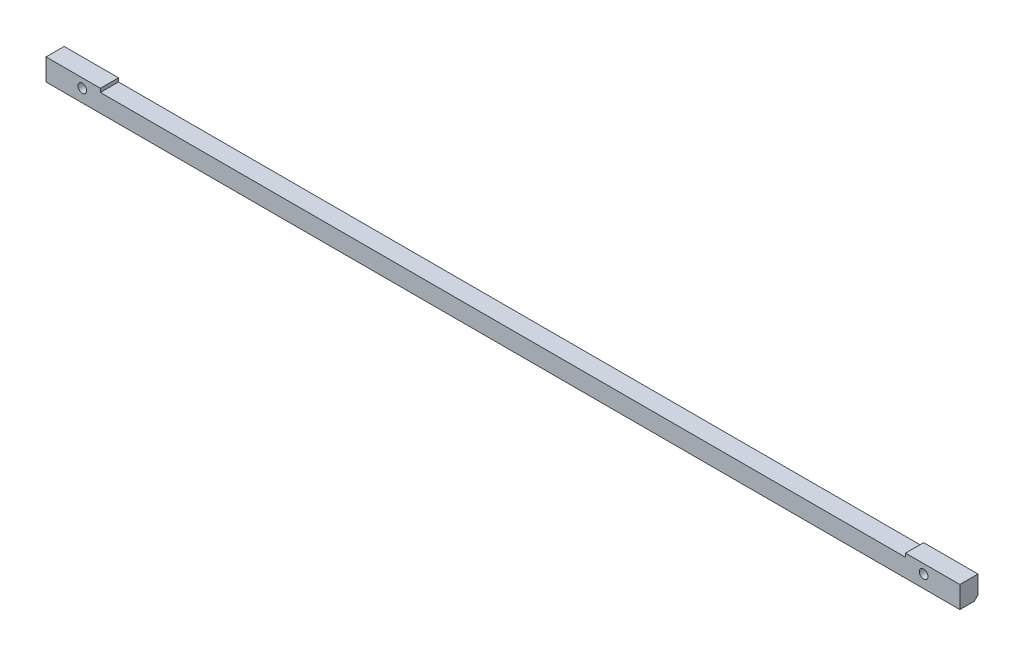
ISO-10303-21;
HEADER;
FILE_DESCRIPTION(('STEP AP214'),'2;1');
FILE_NAME('part.step','',(''),(''),'','','');
FILE_SCHEMA(('AUTOMOTIVE_DESIGN { 1 0 10303 214 1 1 1 1 }'));
ENDSEC;
DATA;
#1=APPLICATION_CONTEXT('core data for automotive mechanical design processes');
#2=APPLICATION_PROTOCOL_DEFINITION('international standard','automotive_design',2000,#1);
#3=PRODUCT_CONTEXT('',#1,'mechanical');
#4=PRODUCT('Part','Part','',(#3));
#5=PRODUCT_RELATED_PRODUCT_CATEGORY('part','',(#4));
#6=PRODUCT_DEFINITION_FORMATION('','',#4);
#7=PRODUCT_DEFINITION_CONTEXT('part definition',#1,'design');
#8=PRODUCT_DEFINITION('design','',#6,#7);
#9=PRODUCT_DEFINITION_SHAPE('','',#8);
#10=(LENGTH_UNIT() NAMED_UNIT(*) SI_UNIT(.MILLI.,.METRE.));
#11=(NAMED_UNIT(*) PLANE_ANGLE_UNIT() SI_UNIT($,.RADIAN.));
#12=(NAMED_UNIT(*) SI_UNIT($,.STERADIAN.) SOLID_ANGLE_UNIT());
#13=UNCERTAINTY_MEASURE_WITH_UNIT(LENGTH_MEASURE(1.E-05),#10,'distance_accuracy_value','');
#14=(GEOMETRIC_REPRESENTATION_CONTEXT(3) GLOBAL_UNCERTAINTY_ASSIGNED_CONTEXT((#13)) GLOBAL_UNIT_ASSIGNED_CONTEXT((#10,
#11,#12)) REPRESENTATION_CONTEXT('',''));
#15=CARTESIAN_POINT('',(0.,0.,0.));
#16=DIRECTION('',(0.,0.,1.));
#17=DIRECTION('',(1.,0.,0.));
#18=AXIS2_PLACEMENT_3D('',#15,#16,#17);
#19=CARTESIAN_POINT('',(126.,0.,5.));
#20=DIRECTION('',(-1.,0.,0.));
#21=DIRECTION('',(0.,0.,1.));
#22=AXIS2_PLACEMENT_3D('',#19,#20,#21);
#23=PLANE('',#22);
#24=DIRECTION('',(0.,0.,-1.));
#25=VECTOR('',#24,1.);
#26=CARTESIAN_POINT('',(126.,0.,5.));
#27=LINE('',#26,#25);
#28=CARTESIAN_POINT('',(126.,0.,5.));
#29=VERTEX_POINT('',#28);
#30=CARTESIAN_POINT('',(126.,0.,1.));
#31=VERTEX_POINT('',#30);
#32=EDGE_CURVE('E147',#29,#31,#27,.T.);
#33=ORIENTED_EDGE('',*,*,#32,.T.);
#34=DIRECTION('',(0.,-0.707106781186547,0.707106781186548));
#35=VECTOR('',#34,1.);
#36=CARTESIAN_POINT('',(126.,0.,1.00000000000002));
#37=LINE('',#36,#35);
#38=CARTESIAN_POINT('',(126.,1.00000000000005,0.));
#39=VERTEX_POINT('',#38);
#40=EDGE_CURVE('E56',#31,#39,#37,.F.);
#41=ORIENTED_EDGE('',*,*,#40,.T.);
#42=DIRECTION('',(0.,1.,0.));
#43=VECTOR('',#42,1.);
#44=CARTESIAN_POINT('',(126.,0.,0.));
#45=LINE('',#44,#43);
#46=CARTESIAN_POINT('',(126.,6.00000000000005,0.));
#47=VERTEX_POINT('',#46);
#48=EDGE_CURVE('E123',#39,#47,#45,.T.);
#49=ORIENTED_EDGE('',*,*,#48,.T.);
#50=DIRECTION('',(0.,0.,-1.));
#51=VECTOR('',#50,1.);
#52=CARTESIAN_POINT('',(126.,6.00000000000005,5.));
#53=LINE('',#52,#51);
#54=CARTESIAN_POINT('',(126.,6.00000000000005,5.));
#55=VERTEX_POINT('',#54);
#56=EDGE_CURVE('E108',#55,#47,#53,.T.);
#57=ORIENTED_EDGE('',*,*,#56,.F.);
#58=DIRECTION('',(0.,1.,0.));
#59=VECTOR('',#58,1.);
#60=CARTESIAN_POINT('',(126.,0.,5.));
#61=LINE('',#60,#59);
#62=EDGE_CURVE('E114',#29,#55,#61,.T.);
#63=ORIENTED_EDGE('',*,*,#62,.F.);
#64=EDGE_LOOP('',(#33,#41,#49,#57,#63));
#65=FACE_BOUND('',#64,.T.);
#66=ADVANCED_FACE('F34',(#65),#23,.F.);
#67=CARTESIAN_POINT('',(126.,6.00000000000005,5.));
#68=DIRECTION('',(0.,-1.,0.));
#69=DIRECTION('',(1.,0.,0.));
#70=AXIS2_PLACEMENT_3D('',#67,#68,#69);
#71=PLANE('',#70);
#72=DIRECTION('',(-1.,0.,0.));
#73=VECTOR('',#72,1.);
#74=CARTESIAN_POINT('',(126.,6.00000000000005,0.));
#75=LINE('',#74,#73);
#76=CARTESIAN_POINT('',(111.,6.00000000000004,0.));
#77=VERTEX_POINT('',#76);
#78=EDGE_CURVE('E158',#47,#77,#75,.T.);
#79=ORIENTED_EDGE('',*,*,#78,.T.);
#80=DIRECTION('',(0.,0.,-1.));
#81=VECTOR('',#80,1.);
#82=CARTESIAN_POINT('',(111.,6.00000000000004,5.));
#83=LINE('',#82,#81);
#84=CARTESIAN_POINT('',(111.,6.00000000000004,5.));
#85=VERTEX_POINT('',#84);
#86=EDGE_CURVE('E110',#85,#77,#83,.T.);
#87=ORIENTED_EDGE('',*,*,#86,.F.);
#88=DIRECTION('',(-1.,0.,0.));
#89=VECTOR('',#88,1.);
#90=CARTESIAN_POINT('',(126.,6.00000000000005,5.));
#91=LINE('',#90,#89);
#92=EDGE_CURVE('E104',#55,#85,#91,.T.);
#93=ORIENTED_EDGE('',*,*,#92,.F.);
#94=ORIENTED_EDGE('',*,*,#56,.T.);
#95=EDGE_LOOP('',(#79,#87,#93,#94));
#96=FACE_BOUND('',#95,.T.);
#97=ADVANCED_FACE('F106',(#96),#71,.F.);
#98=CARTESIAN_POINT('',(111.,6.00000000000004,5.));
#99=DIRECTION('',(1.,0.,0.));
#100=DIRECTION('',(0.,0.,-1.));
#101=AXIS2_PLACEMENT_3D('',#98,#99,#100);
#102=PLANE('',#101);
#103=DIRECTION('',(0.,-1.,0.));
#104=VECTOR('',#103,1.);
#105=CARTESIAN_POINT('',(111.,6.00000000000004,0.));
#106=LINE('',#105,#104);
#107=CARTESIAN_POINT('',(111.,4.99999999999996,0.));
#108=VERTEX_POINT('',#107);
#109=EDGE_CURVE('E156',#77,#108,#106,.T.);
#110=ORIENTED_EDGE('',*,*,#109,.T.);
#111=DIRECTION('',(0.,0.,-1.));
#112=VECTOR('',#111,1.);
#113=CARTESIAN_POINT('',(111.,4.99999999999996,5.));
#114=LINE('',#113,#112);
#115=CARTESIAN_POINT('',(111.,4.99999999999996,5.));
#116=VERTEX_POINT('',#115);
#117=EDGE_CURVE('E129',#116,#108,#114,.T.);
#118=ORIENTED_EDGE('',*,*,#117,.F.);
#119=DIRECTION('',(0.,-1.,0.));
#120=VECTOR('',#119,1.);
#121=CARTESIAN_POINT('',(111.,6.00000000000004,5.));
#122=LINE('',#121,#120);
#123=EDGE_CURVE('E113',#85,#116,#122,.T.);
#124=ORIENTED_EDGE('',*,*,#123,.F.);
#125=ORIENTED_EDGE('',*,*,#86,.T.);
#126=EDGE_LOOP('',(#110,#118,#124,#125));
#127=FACE_BOUND('',#126,.T.);
#128=ADVANCED_FACE('F227',(#127),#102,.F.);
#129=CARTESIAN_POINT('',(111.,4.99999999999996,5.));
#130=DIRECTION('',(0.,-1.,0.));
#131=DIRECTION('',(0.,0.,-1.));
#132=AXIS2_PLACEMENT_3D('',#129,#130,#131);
#133=PLANE('',#132);
#134=DIRECTION('',(-1.,0.,0.));
#135=VECTOR('',#134,1.);
#136=CARTESIAN_POINT('',(111.,4.99999999999996,0.));
#137=LINE('',#136,#135);
#138=CARTESIAN_POINT('',(-111.,4.99999999999996,0.));
#139=VERTEX_POINT('',#138);
#140=EDGE_CURVE('E154',#108,#139,#137,.T.);
#141=ORIENTED_EDGE('',*,*,#140,.T.);
#142=DIRECTION('',(0.,0.,-1.));
#143=VECTOR('',#142,1.);
#144=CARTESIAN_POINT('',(-111.,4.99999999999996,5.));
#145=LINE('',#144,#143);
#146=CARTESIAN_POINT('',(-111.,4.99999999999996,5.));
#147=VERTEX_POINT('',#146);
#148=EDGE_CURVE('E135',#147,#139,#145,.T.);
#149=ORIENTED_EDGE('',*,*,#148,.F.);
#150=DIRECTION('',(-1.,0.,0.));
#151=VECTOR('',#150,1.);
#152=CARTESIAN_POINT('',(111.,4.99999999999996,5.));
#153=LINE('',#152,#151);
#154=EDGE_CURVE('E169',#116,#147,#153,.T.);
#155=ORIENTED_EDGE('',*,*,#154,.F.);
#156=ORIENTED_EDGE('',*,*,#117,.T.);
#157=EDGE_LOOP('',(#141,#149,#155,#156));
#158=FACE_BOUND('',#157,.T.);
#159=ADVANCED_FACE('F232',(#158),#133,.F.);
#160=CARTESIAN_POINT('',(-111.,6.00000000000004,5.));
#161=DIRECTION('',(-1.,0.,0.));
#162=DIRECTION('',(0.,0.,1.));
#163=AXIS2_PLACEMENT_3D('',#160,#161,#162);
#164=PLANE('',#163);
#165=DIRECTION('',(0.,1.,0.));
#166=VECTOR('',#165,1.);
#167=CARTESIAN_POINT('',(-111.,6.00000000000004,0.));
#168=LINE('',#167,#166);
#169=CARTESIAN_POINT('',(-111.,6.00000000000004,0.));
#170=VERTEX_POINT('',#169);
#171=EDGE_CURVE('E152',#139,#170,#168,.T.);
#172=ORIENTED_EDGE('',*,*,#171,.T.);
#173=DIRECTION('',(0.,0.,-1.));
#174=VECTOR('',#173,1.);
#175=CARTESIAN_POINT('',(-111.,6.00000000000004,5.));
#176=LINE('',#175,#174);
#177=CARTESIAN_POINT('',(-111.,6.00000000000004,5.));
#178=VERTEX_POINT('',#177);
#179=EDGE_CURVE('E138',#178,#170,#176,.T.);
#180=ORIENTED_EDGE('',*,*,#179,.F.);
#181=DIRECTION('',(0.,1.,0.));
#182=VECTOR('',#181,1.);
#183=CARTESIAN_POINT('',(-111.,6.00000000000004,5.));
#184=LINE('',#183,#182);
#185=EDGE_CURVE('E167',#147,#178,#184,.T.);
#186=ORIENTED_EDGE('',*,*,#185,.F.);
#187=ORIENTED_EDGE('',*,*,#148,.T.);
#188=EDGE_LOOP('',(#172,#180,#186,#187));
#189=FACE_BOUND('',#188,.T.);
#190=ADVANCED_FACE('F236',(#189),#164,.F.);
#191=CARTESIAN_POINT('',(-126.,6.00000000000005,5.));
#192=DIRECTION('',(0.,-1.,0.));
#193=DIRECTION('',(1.,0.,0.));
#194=AXIS2_PLACEMENT_3D('',#191,#192,#193);
#195=PLANE('',#194);
#196=DIRECTION('',(-1.,0.,0.));
#197=VECTOR('',#196,1.);
#198=CARTESIAN_POINT('',(-126.,6.00000000000005,0.));
#199=LINE('',#198,#197);
#200=CARTESIAN_POINT('',(-126.,6.00000000000005,0.));
#201=VERTEX_POINT('',#200);
#202=EDGE_CURVE('E150',#170,#201,#199,.T.);
#203=ORIENTED_EDGE('',*,*,#202,.T.);
#204=DIRECTION('',(0.,0.,-1.));
#205=VECTOR('',#204,1.);
#206=CARTESIAN_POINT('',(-126.,6.00000000000005,5.));
#207=LINE('',#206,#205);
#208=CARTESIAN_POINT('',(-126.,6.00000000000005,5.));
#209=VERTEX_POINT('',#208);
#210=EDGE_CURVE('E141',#209,#201,#207,.T.);
#211=ORIENTED_EDGE('',*,*,#210,.F.);
#212=DIRECTION('',(-1.,0.,0.));
#213=VECTOR('',#212,1.);
#214=CARTESIAN_POINT('',(-126.,6.00000000000005,5.));
#215=LINE('',#214,#213);
#216=EDGE_CURVE('E165',#178,#209,#215,.T.);
#217=ORIENTED_EDGE('',*,*,#216,.F.);
#218=ORIENTED_EDGE('',*,*,#179,.T.);
#219=EDGE_LOOP('',(#203,#211,#217,#218));
#220=FACE_BOUND('',#219,.T.);
#221=ADVANCED_FACE('F221',(#220),#195,.F.);
#222=CARTESIAN_POINT('',(-126.,0.,5.));
#223=DIRECTION('',(1.,0.,0.));
#224=DIRECTION('',(0.,0.,-1.));
#225=AXIS2_PLACEMENT_3D('',#222,#223,#224);
#226=PLANE('',#225);
#227=DIRECTION('',(0.,-1.,0.));
#228=VECTOR('',#227,1.);
#229=CARTESIAN_POINT('',(-126.,0.,0.));
#230=LINE('',#229,#228);
#231=CARTESIAN_POINT('',(-126.,1.,0.));
#232=VERTEX_POINT('',#231);
#233=EDGE_CURVE('E121',#201,#232,#230,.T.);
#234=ORIENTED_EDGE('',*,*,#233,.T.);
#235=DIRECTION('',(0.,0.707106781186547,-0.707106781186548));
#236=VECTOR('',#235,1.);
#237=CARTESIAN_POINT('',(-126.,0.,1.));
#238=LINE('',#237,#236);
#239=CARTESIAN_POINT('',(-126.,0.,1.));
#240=VERTEX_POINT('',#239);
#241=EDGE_CURVE('E11',#232,#240,#238,.F.);
#242=ORIENTED_EDGE('',*,*,#241,.T.);
#243=DIRECTION('',(0.,0.,-1.));
#244=VECTOR('',#243,1.);
#245=CARTESIAN_POINT('',(-126.,0.,5.));
#246=LINE('',#245,#244);
#247=CARTESIAN_POINT('',(-126.,0.,5.));
#248=VERTEX_POINT('',#247);
#249=EDGE_CURVE('E144',#248,#240,#246,.T.);
#250=ORIENTED_EDGE('',*,*,#249,.F.);
#251=DIRECTION('',(0.,-1.,0.));
#252=VECTOR('',#251,1.);
#253=CARTESIAN_POINT('',(-126.,0.,5.));
#254=LINE('',#253,#252);
#255=EDGE_CURVE('E163',#209,#248,#254,.T.);
#256=ORIENTED_EDGE('',*,*,#255,.F.);
#257=ORIENTED_EDGE('',*,*,#210,.T.);
#258=EDGE_LOOP('',(#234,#242,#250,#256,#257));
#259=FACE_BOUND('',#258,.T.);
#260=ADVANCED_FACE('F209',(#259),#226,.F.);
#261=CARTESIAN_POINT('',(-126.,0.,5.));
#262=DIRECTION('',(0.,1.,0.));
#263=DIRECTION('',(-1.,0.,0.));
#264=AXIS2_PLACEMENT_3D('',#261,#262,#263);
#265=PLANE('',#264);
#266=ORIENTED_EDGE('',*,*,#249,.T.);
#267=DIRECTION('',(1.,0.,0.));
#268=VECTOR('',#267,1.);
#269=CARTESIAN_POINT('',(-126.,0.,1.));
#270=LINE('',#269,#268);
#271=EDGE_CURVE('E125',#240,#31,#270,.T.);
#272=ORIENTED_EDGE('',*,*,#271,.T.);
#273=ORIENTED_EDGE('',*,*,#32,.F.);
#274=DIRECTION('',(1.,0.,0.));
#275=VECTOR('',#274,1.);
#276=CARTESIAN_POINT('',(-126.,0.,5.));
#277=LINE('',#276,#275);
#278=EDGE_CURVE('E119',#248,#29,#277,.T.);
#279=ORIENTED_EDGE('',*,*,#278,.F.);
#280=EDGE_LOOP('',(#266,#272,#273,#279));
#281=FACE_BOUND('',#280,.T.);
#282=ADVANCED_FACE('F212',(#281),#265,.F.);
#283=CARTESIAN_POINT('',(126.,6.00000000000005,5.));
#284=DIRECTION('',(0.,0.,1.));
#285=DIRECTION('',(1.,0.,0.));
#286=AXIS2_PLACEMENT_3D('',#283,#284,#285);
#287=PLANE('',#286);
#288=CARTESIAN_POINT('',(116.,3.50000000000005,5.));
#289=DIRECTION('',(0.,0.,-1.));
#290=DIRECTION('',(-1.,0.,0.));
#291=AXIS2_PLACEMENT_3D('',#288,#289,#290);
#292=CIRCLE('',#291,1.19999999999999);
#293=CARTESIAN_POINT('',(114.8,3.50000000000005,5.));
#294=VERTEX_POINT('',#293);
#295=EDGE_CURVE('E183',#294,#294,#292,.T.);
#296=ORIENTED_EDGE('',*,*,#295,.T.);
#297=EDGE_LOOP('',(#296));
#298=FACE_BOUND('',#297,.T.);
#299=CARTESIAN_POINT('',(-116.,3.50000000000004,5.));
#300=DIRECTION('',(0.,0.,-1.));
#301=DIRECTION('',(-1.,0.,0.));
#302=AXIS2_PLACEMENT_3D('',#299,#300,#301);
#303=CIRCLE('',#302,1.19999999999999);
#304=CARTESIAN_POINT('',(-117.2,3.50000000000004,5.));
#305=VERTEX_POINT('',#304);
#306=EDGE_CURVE('E161',#305,#305,#303,.T.);
#307=ORIENTED_EDGE('',*,*,#306,.T.);
#308=EDGE_LOOP('',(#307));
#309=FACE_BOUND('',#308,.T.);
#310=ORIENTED_EDGE('',*,*,#62,.T.);
#311=ORIENTED_EDGE('',*,*,#92,.T.);
#312=ORIENTED_EDGE('',*,*,#123,.T.);
#313=ORIENTED_EDGE('',*,*,#154,.T.);
#314=ORIENTED_EDGE('',*,*,#185,.T.);
#315=ORIENTED_EDGE('',*,*,#216,.T.);
#316=ORIENTED_EDGE('',*,*,#255,.T.);
#317=ORIENTED_EDGE('',*,*,#278,.T.);
#318=EDGE_LOOP('',(#310,#311,#312,#313,#314,#315,#316,#317));
#319=FACE_BOUND('',#318,.T.);
#320=ADVANCED_FACE('F117',(#298,#309,#319),#287,.T.);
#321=CARTESIAN_POINT('',(126.,6.00000000000005,0.));
#322=DIRECTION('',(0.,0.,1.));
#323=DIRECTION('',(1.,0.,0.));
#324=AXIS2_PLACEMENT_3D('',#321,#322,#323);
#325=PLANE('',#324);
#326=CARTESIAN_POINT('',(116.,3.50000000000005,0.));
#327=DIRECTION('',(0.,0.,-1.));
#328=DIRECTION('',(-1.,0.,0.));
#329=AXIS2_PLACEMENT_3D('',#326,#327,#328);
#330=CIRCLE('',#329,2.19999999999999);
#331=CARTESIAN_POINT('',(113.8,3.50000000000005,0.));
#332=VERTEX_POINT('',#331);
#333=EDGE_CURVE('E192',#332,#332,#330,.T.);
#334=ORIENTED_EDGE('',*,*,#333,.F.);
#335=EDGE_LOOP('',(#334));
#336=FACE_BOUND('',#335,.T.);
#337=CARTESIAN_POINT('',(-116.,3.50000000000004,0.));
#338=DIRECTION('',(0.,0.,-1.));
#339=DIRECTION('',(-1.,0.,0.));
#340=AXIS2_PLACEMENT_3D('',#337,#338,#339);
#341=CIRCLE('',#340,2.19999999999999);
#342=CARTESIAN_POINT('',(-118.2,3.50000000000004,0.));
#343=VERTEX_POINT('',#342);
#344=EDGE_CURVE('E180',#343,#343,#341,.T.);
#345=ORIENTED_EDGE('',*,*,#344,.F.);
#346=EDGE_LOOP('',(#345));
#347=FACE_BOUND('',#346,.T.);
#348=ORIENTED_EDGE('',*,*,#48,.F.);
#349=DIRECTION('',(-1.,0.,0.));
#350=VECTOR('',#349,1.);
#351=CARTESIAN_POINT('',(126.,1.00000000000005,0.));
#352=LINE('',#351,#350);
#353=EDGE_CURVE('E42',#39,#232,#352,.T.);
#354=ORIENTED_EDGE('',*,*,#353,.T.);
#355=ORIENTED_EDGE('',*,*,#233,.F.);
#356=ORIENTED_EDGE('',*,*,#202,.F.);
#357=ORIENTED_EDGE('',*,*,#171,.F.);
#358=ORIENTED_EDGE('',*,*,#140,.F.);
#359=ORIENTED_EDGE('',*,*,#109,.F.);
#360=ORIENTED_EDGE('',*,*,#78,.F.);
#361=EDGE_LOOP('',(#348,#354,#355,#356,#357,#358,#359,#360));
#362=FACE_BOUND('',#361,.T.);
#363=ADVANCED_FACE('F198',(#336,#347,#362),#325,.F.);
#364=CARTESIAN_POINT('',(-126.,0.,1.));
#365=DIRECTION('',(0.,0.707106781186548,0.707106781186547));
#366=DIRECTION('',(0.,-0.707106781186547,0.707106781186548));
#367=AXIS2_PLACEMENT_3D('',#364,#365,#366);
#368=PLANE('',#367);
#369=ORIENTED_EDGE('',*,*,#241,.F.);
#370=ORIENTED_EDGE('',*,*,#353,.F.);
#371=ORIENTED_EDGE('',*,*,#40,.F.);
#372=ORIENTED_EDGE('',*,*,#271,.F.);
#373=EDGE_LOOP('',(#369,#370,#371,#372));
#374=FACE_BOUND('',#373,.T.);
#375=ADVANCED_FACE('F36',(#374),#368,.F.);
#376=CARTESIAN_POINT('',(-116.,3.50000000000004,0.));
#377=DIRECTION('',(0.,0.,-1.));
#378=DIRECTION('',(-1.,0.,0.));
#379=AXIS2_PLACEMENT_3D('',#376,#377,#378);
#380=CYLINDRICAL_SURFACE('',#379,1.19999999999999);
#381=ORIENTED_EDGE('',*,*,#306,.F.);
#382=EDGE_LOOP('',(#381));
#383=FACE_BOUND('',#382,.T.);
#384=CARTESIAN_POINT('',(-116.,3.50000000000004,2.9));
#385=DIRECTION('',(0.,0.,-1.));
#386=DIRECTION('',(-1.,0.,0.));
#387=AXIS2_PLACEMENT_3D('',#384,#385,#386);
#388=CIRCLE('',#387,1.19999999999999);
#389=CARTESIAN_POINT('',(-117.2,3.50000000000004,2.9));
#390=VERTEX_POINT('',#389);
#391=EDGE_CURVE('E174',#390,#390,#388,.T.);
#392=ORIENTED_EDGE('',*,*,#391,.T.);
#393=EDGE_LOOP('',(#392));
#394=FACE_BOUND('',#393,.T.);
#395=ADVANCED_FACE('F277',(#383,#394),#380,.F.);
#396=CARTESIAN_POINT('',(-114.8,3.50000000000004,2.9));
#397=DIRECTION('',(0.,0.,1.));
#398=DIRECTION('',(1.,0.,0.));
#399=AXIS2_PLACEMENT_3D('',#396,#397,#398);
#400=PLANE('',#399);
#401=ORIENTED_EDGE('',*,*,#391,.F.);
#402=EDGE_LOOP('',(#401));
#403=FACE_BOUND('',#402,.T.);
#404=CARTESIAN_POINT('',(-116.,3.50000000000004,2.9));
#405=DIRECTION('',(0.,0.,-1.));
#406=DIRECTION('',(-1.,0.,0.));
#407=AXIS2_PLACEMENT_3D('',#404,#405,#406);
#408=CIRCLE('',#407,2.19999999999999);
#409=CARTESIAN_POINT('',(-118.2,3.50000000000004,2.9));
#410=VERTEX_POINT('',#409);
#411=EDGE_CURVE('E177',#410,#410,#408,.T.);
#412=ORIENTED_EDGE('',*,*,#411,.T.);
#413=EDGE_LOOP('',(#412));
#414=FACE_BOUND('',#413,.T.);
#415=ADVANCED_FACE('F296',(#403,#414),#400,.F.);
#416=CARTESIAN_POINT('',(-116.,3.50000000000004,0.));
#417=DIRECTION('',(0.,0.,-1.));
#418=DIRECTION('',(-1.,0.,0.));
#419=AXIS2_PLACEMENT_3D('',#416,#417,#418);
#420=CYLINDRICAL_SURFACE('',#419,2.19999999999999);
#421=ORIENTED_EDGE('',*,*,#411,.F.);
#422=EDGE_LOOP('',(#421));
#423=FACE_BOUND('',#422,.T.);
#424=ORIENTED_EDGE('',*,*,#344,.T.);
#425=EDGE_LOOP('',(#424));
#426=FACE_BOUND('',#425,.T.);
#427=ADVANCED_FACE('F306',(#423,#426),#420,.F.);
#428=CARTESIAN_POINT('',(116.,3.50000000000005,0.));
#429=DIRECTION('',(0.,0.,-1.));
#430=DIRECTION('',(-1.,0.,0.));
#431=AXIS2_PLACEMENT_3D('',#428,#429,#430);
#432=CYLINDRICAL_SURFACE('',#431,1.19999999999999);
#433=ORIENTED_EDGE('',*,*,#295,.F.);
#434=EDGE_LOOP('',(#433));
#435=FACE_BOUND('',#434,.T.);
#436=CARTESIAN_POINT('',(116.,3.50000000000005,2.9));
#437=DIRECTION('',(0.,0.,-1.));
#438=DIRECTION('',(-1.,0.,0.));
#439=AXIS2_PLACEMENT_3D('',#436,#437,#438);
#440=CIRCLE('',#439,1.19999999999999);
#441=CARTESIAN_POINT('',(114.8,3.50000000000005,2.9));
#442=VERTEX_POINT('',#441);
#443=EDGE_CURVE('E186',#442,#442,#440,.T.);
#444=ORIENTED_EDGE('',*,*,#443,.T.);
#445=EDGE_LOOP('',(#444));
#446=FACE_BOUND('',#445,.T.);
#447=ADVANCED_FACE('F316',(#435,#446),#432,.F.);
#448=CARTESIAN_POINT('',(117.2,3.50000000000005,2.9));
#449=DIRECTION('',(0.,0.,1.));
#450=DIRECTION('',(1.,0.,0.));
#451=AXIS2_PLACEMENT_3D('',#448,#449,#450);
#452=PLANE('',#451);
#453=ORIENTED_EDGE('',*,*,#443,.F.);
#454=EDGE_LOOP('',(#453));
#455=FACE_BOUND('',#454,.T.);
#456=CARTESIAN_POINT('',(116.,3.50000000000005,2.9));
#457=DIRECTION('',(0.,0.,-1.));
#458=DIRECTION('',(-1.,0.,0.));
#459=AXIS2_PLACEMENT_3D('',#456,#457,#458);
#460=CIRCLE('',#459,2.19999999999999);
#461=CARTESIAN_POINT('',(113.8,3.50000000000005,2.9));
#462=VERTEX_POINT('',#461);
#463=EDGE_CURVE('E189',#462,#462,#460,.T.);
#464=ORIENTED_EDGE('',*,*,#463,.T.);
#465=EDGE_LOOP('',(#464));
#466=FACE_BOUND('',#465,.T.);
#467=ADVANCED_FACE('F326',(#455,#466),#452,.F.);
#468=CARTESIAN_POINT('',(116.,3.50000000000005,0.));
#469=DIRECTION('',(0.,0.,-1.));
#470=DIRECTION('',(-1.,0.,0.));
#471=AXIS2_PLACEMENT_3D('',#468,#469,#470);
#472=CYLINDRICAL_SURFACE('',#471,2.19999999999999);
#473=ORIENTED_EDGE('',*,*,#463,.F.);
#474=EDGE_LOOP('',(#473));
#475=FACE_BOUND('',#474,.T.);
#476=ORIENTED_EDGE('',*,*,#333,.T.);
#477=EDGE_LOOP('',(#476));
#478=FACE_BOUND('',#477,.T.);
#479=ADVANCED_FACE('F196',(#475,#478),#472,.F.);
#480=CLOSED_SHELL('',(#66,#97,#128,#159,#190,#221,#260,#282,#320,#363,#375,#395,#415,#427,#447,
#467,#479));
#481=MANIFOLD_SOLID_BREP('B2',#480);
#482=ADVANCED_BREP_SHAPE_REPRESENTATION('',(#18,#481),#14);
#483=SHAPE_DEFINITION_REPRESENTATION(#9,#482);
ENDSEC;
END-ISO-10303-21;
